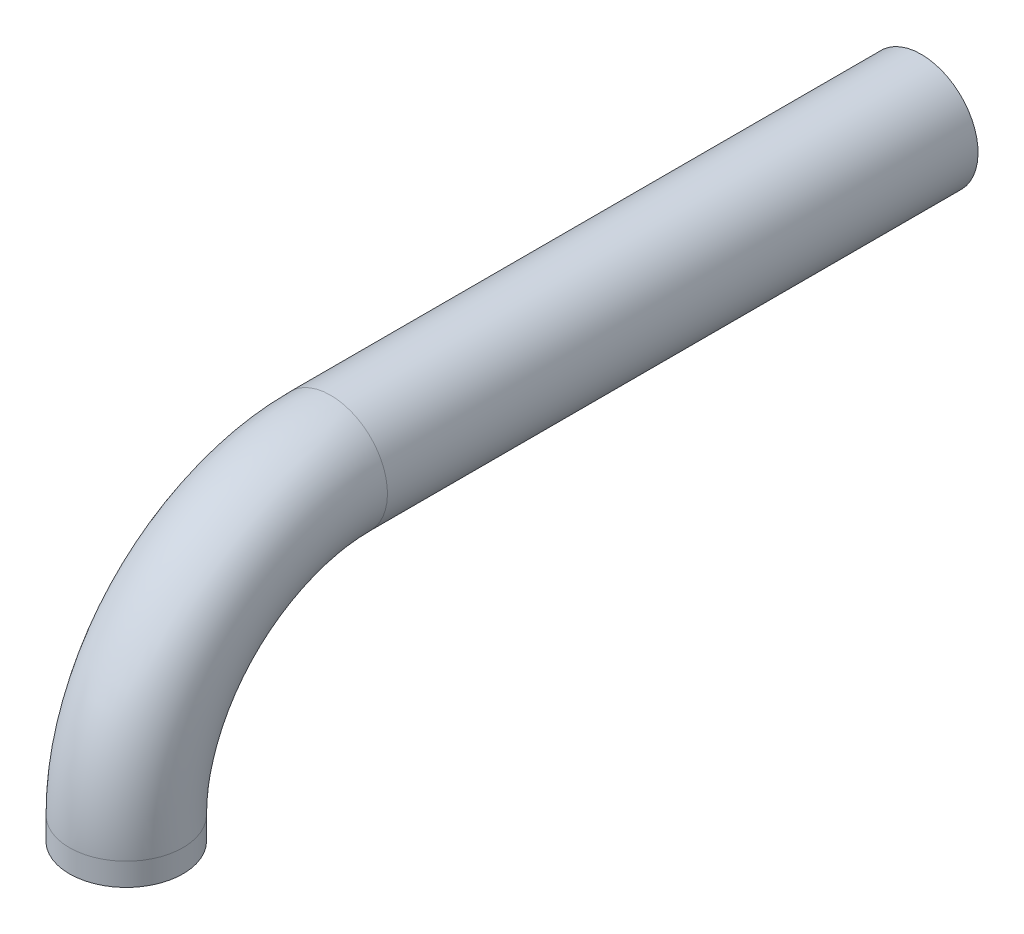
ISO-10303-21;
HEADER;
FILE_DESCRIPTION(('STEP AP214'),'2;1');
FILE_NAME('part.step','',(''),(''),'','','');
FILE_SCHEMA(('AUTOMOTIVE_DESIGN { 1 0 10303 214 1 1 1 1 }'));
ENDSEC;
DATA;
#1=APPLICATION_CONTEXT('core data for automotive mechanical design processes');
#2=APPLICATION_PROTOCOL_DEFINITION('international standard','automotive_design',2000,#1);
#3=PRODUCT_CONTEXT('',#1,'mechanical');
#4=PRODUCT('Part','Part','',(#3));
#5=PRODUCT_RELATED_PRODUCT_CATEGORY('part','',(#4));
#6=PRODUCT_DEFINITION_FORMATION('','',#4);
#7=PRODUCT_DEFINITION_CONTEXT('part definition',#1,'design');
#8=PRODUCT_DEFINITION('design','',#6,#7);
#9=PRODUCT_DEFINITION_SHAPE('','',#8);
#10=(LENGTH_UNIT() NAMED_UNIT(*) SI_UNIT(.MILLI.,.METRE.));
#11=(NAMED_UNIT(*) PLANE_ANGLE_UNIT() SI_UNIT($,.RADIAN.));
#12=(NAMED_UNIT(*) SI_UNIT($,.STERADIAN.) SOLID_ANGLE_UNIT());
#13=UNCERTAINTY_MEASURE_WITH_UNIT(LENGTH_MEASURE(1.E-05),#10,'distance_accuracy_value','');
#14=(GEOMETRIC_REPRESENTATION_CONTEXT(3) GLOBAL_UNCERTAINTY_ASSIGNED_CONTEXT((#13)) GLOBAL_UNIT_ASSIGNED_CONTEXT((#10,
#11,#12)) REPRESENTATION_CONTEXT('',''));
#15=CARTESIAN_POINT('',(0.,0.,0.));
#16=DIRECTION('',(0.,0.,1.));
#17=DIRECTION('',(1.,0.,0.));
#18=AXIS2_PLACEMENT_3D('',#15,#16,#17);
#19=CARTESIAN_POINT('',(0.,5.,-4.50000000000003));
#20=DIRECTION('',(0.,0.,-1.));
#21=DIRECTION('',(-1.,0.,0.));
#22=AXIS2_PLACEMENT_3D('',#19,#20,#21);
#23=CYLINDRICAL_SURFACE('',#22,1.25);
#24=CARTESIAN_POINT('',(0.,5.,-4.50000000000003));
#25=DIRECTION('',(0.,0.,-1.));
#26=DIRECTION('',(0.,1.,0.));
#27=AXIS2_PLACEMENT_3D('',#24,#25,#26);
#28=CIRCLE('',#27,1.25);
#29=CARTESIAN_POINT('',(0.,6.25,-4.50000000000004));
#30=VERTEX_POINT('',#29);
#31=EDGE_CURVE('E41',#30,#30,#28,.T.);
#32=ORIENTED_EDGE('',*,*,#31,.T.);
#33=EDGE_LOOP('',(#32));
#34=FACE_BOUND('',#33,.T.);
#35=CARTESIAN_POINT('',(0.,5.,-17.5));
#36=DIRECTION('',(0.,0.,-1.));
#37=DIRECTION('',(0.,1.,0.));
#38=AXIS2_PLACEMENT_3D('',#35,#36,#37);
#39=CIRCLE('',#38,1.25);
#40=CARTESIAN_POINT('',(0.,6.25,-17.5));
#41=VERTEX_POINT('',#40);
#42=EDGE_CURVE('E10',#41,#41,#39,.T.);
#43=ORIENTED_EDGE('',*,*,#42,.F.);
#44=EDGE_LOOP('',(#43));
#45=FACE_BOUND('',#44,.T.);
#46=ADVANCED_FACE('F31',(#34,#45),#23,.T.);
#47=CARTESIAN_POINT('',(0.,5.,-4.50000000000003));
#48=DIRECTION('',(0.,0.,-1.));
#49=DIRECTION('',(-1.,0.,0.));
#50=AXIS2_PLACEMENT_3D('',#47,#48,#49);
#51=CYLINDRICAL_SURFACE('',#50,1.);
#52=CARTESIAN_POINT('',(0.,5.,-4.50000000000003));
#53=DIRECTION('',(0.,0.,-1.));
#54=DIRECTION('',(0.,1.,0.));
#55=AXIS2_PLACEMENT_3D('',#52,#53,#54);
#56=CIRCLE('',#55,1.);
#57=CARTESIAN_POINT('',(0.,6.,-4.50000000000004));
#58=VERTEX_POINT('',#57);
#59=EDGE_CURVE('E45',#58,#58,#56,.T.);
#60=ORIENTED_EDGE('',*,*,#59,.F.);
#61=EDGE_LOOP('',(#60));
#62=FACE_BOUND('',#61,.T.);
#63=CARTESIAN_POINT('',(0.,5.,-17.5));
#64=DIRECTION('',(0.,0.,-1.));
#65=DIRECTION('',(0.,1.,0.));
#66=AXIS2_PLACEMENT_3D('',#63,#64,#65);
#67=CIRCLE('',#66,1.);
#68=CARTESIAN_POINT('',(0.,6.,-17.5));
#69=VERTEX_POINT('',#68);
#70=EDGE_CURVE('E37',#69,#69,#67,.T.);
#71=ORIENTED_EDGE('',*,*,#70,.T.);
#72=EDGE_LOOP('',(#71));
#73=FACE_BOUND('',#72,.T.);
#74=ADVANCED_FACE('F73',(#62,#73),#51,.F.);
#75=CARTESIAN_POINT('',(0.,0.5,-4.5));
#76=DIRECTION('',(-1.,0.,0.));
#77=DIRECTION('',(0.,0.,1.));
#78=AXIS2_PLACEMENT_3D('',#75,#76,#77);
#79=TOROIDAL_SURFACE('',#78,4.5,1.25);
#80=CARTESIAN_POINT('',(0.,0.499999999999968,0.));
#81=DIRECTION('',(0.,1.,0.));
#82=DIRECTION('',(0.,0.,1.));
#83=AXIS2_PLACEMENT_3D('',#80,#81,#82);
#84=CIRCLE('',#83,1.25);
#85=CARTESIAN_POINT('',(0.,0.499999999999959,1.25));
#86=VERTEX_POINT('',#85);
#87=EDGE_CURVE('E50',#86,#86,#84,.T.);
#88=CARTESIAN_POINT('',(0.,0.5,-4.5));
#89=DIRECTION('',(-1.,0.,0.));
#90=DIRECTION('',(0.,0.,1.));
#91=AXIS2_PLACEMENT_3D('',#88,#89,#90);
#92=CIRCLE('',#91,5.75);
#93=EDGE_CURVE('',#86,#30,#92,.T.);
#94=ORIENTED_EDGE('',*,*,#87,.T.);
#95=ORIENTED_EDGE('',*,*,#31,.F.);
#96=ORIENTED_EDGE('',*,*,#93,.T.);
#97=ORIENTED_EDGE('',*,*,#93,.F.);
#98=EDGE_LOOP('',(#94,#96,#95,#97));
#99=FACE_BOUND('',#98,.T.);
#100=ADVANCED_FACE('F69',(#99),#79,.T.);
#101=CARTESIAN_POINT('',(0.,0.5,-4.5));
#102=DIRECTION('',(-1.,0.,0.));
#103=DIRECTION('',(0.,0.,1.));
#104=AXIS2_PLACEMENT_3D('',#101,#102,#103);
#105=TOROIDAL_SURFACE('',#104,4.5,1.);
#106=CARTESIAN_POINT('',(0.,0.499999999999968,0.));
#107=DIRECTION('',(0.,1.,0.));
#108=DIRECTION('',(0.,0.,1.));
#109=AXIS2_PLACEMENT_3D('',#106,#107,#108);
#110=CIRCLE('',#109,1.);
#111=CARTESIAN_POINT('',(0.,0.499999999999961,1.));
#112=VERTEX_POINT('',#111);
#113=EDGE_CURVE('E54',#112,#112,#110,.T.);
#114=CARTESIAN_POINT('',(0.,0.5,-4.5));
#115=DIRECTION('',(-1.,0.,0.));
#116=DIRECTION('',(0.,0.,1.));
#117=AXIS2_PLACEMENT_3D('',#114,#115,#116);
#118=CIRCLE('',#117,5.5);
#119=EDGE_CURVE('',#112,#58,#118,.T.);
#120=ORIENTED_EDGE('',*,*,#113,.F.);
#121=ORIENTED_EDGE('',*,*,#59,.T.);
#122=ORIENTED_EDGE('',*,*,#119,.T.);
#123=ORIENTED_EDGE('',*,*,#119,.F.);
#124=EDGE_LOOP('',(#120,#122,#121,#123));
#125=FACE_BOUND('',#124,.T.);
#126=ADVANCED_FACE('F66',(#125),#105,.F.);
#127=CARTESIAN_POINT('',(0.,0.499999999999968,0.));
#128=DIRECTION('',(0.,-1.,0.));
#129=DIRECTION('',(0.,0.,-1.));
#130=AXIS2_PLACEMENT_3D('',#127,#128,#129);
#131=CYLINDRICAL_SURFACE('',#130,1.);
#132=ORIENTED_EDGE('',*,*,#113,.T.);
#133=EDGE_LOOP('',(#132));
#134=FACE_BOUND('',#133,.T.);
#135=CARTESIAN_POINT('',(0.,0.,0.));
#136=DIRECTION('',(0.,1.,0.));
#137=DIRECTION('',(0.,0.,1.));
#138=AXIS2_PLACEMENT_3D('',#135,#136,#137);
#139=CIRCLE('',#138,1.);
#140=CARTESIAN_POINT('',(0.,0.,1.));
#141=VERTEX_POINT('',#140);
#142=EDGE_CURVE('E55',#141,#141,#139,.T.);
#143=ORIENTED_EDGE('',*,*,#142,.F.);
#144=EDGE_LOOP('',(#143));
#145=FACE_BOUND('',#144,.T.);
#146=ADVANCED_FACE('F63',(#134,#145),#131,.F.);
#147=CARTESIAN_POINT('',(0.,0.499999999999968,0.));
#148=DIRECTION('',(0.,-1.,0.));
#149=DIRECTION('',(0.,0.,-1.));
#150=AXIS2_PLACEMENT_3D('',#147,#148,#149);
#151=CYLINDRICAL_SURFACE('',#150,1.25);
#152=ORIENTED_EDGE('',*,*,#87,.F.);
#153=EDGE_LOOP('',(#152));
#154=FACE_BOUND('',#153,.T.);
#155=CARTESIAN_POINT('',(0.,0.,0.));
#156=DIRECTION('',(0.,1.,0.));
#157=DIRECTION('',(0.,0.,1.));
#158=AXIS2_PLACEMENT_3D('',#155,#156,#157);
#159=CIRCLE('',#158,1.25);
#160=CARTESIAN_POINT('',(0.,0.,1.25));
#161=VERTEX_POINT('',#160);
#162=EDGE_CURVE('E51',#161,#161,#159,.T.);
#163=ORIENTED_EDGE('',*,*,#162,.T.);
#164=EDGE_LOOP('',(#163));
#165=FACE_BOUND('',#164,.T.);
#166=ADVANCED_FACE('F85',(#154,#165),#151,.T.);
#167=CARTESIAN_POINT('',(0.,5.,-17.5));
#168=DIRECTION('',(0.,0.,-1.));
#169=DIRECTION('',(0.,1.,0.));
#170=AXIS2_PLACEMENT_3D('',#167,#168,#169);
#171=PLANE('',#170);
#172=ORIENTED_EDGE('',*,*,#70,.F.);
#173=EDGE_LOOP('',(#172));
#174=FACE_BOUND('',#173,.T.);
#175=ORIENTED_EDGE('',*,*,#42,.T.);
#176=EDGE_LOOP('',(#175));
#177=FACE_BOUND('',#176,.T.);
#178=ADVANCED_FACE('F88',(#174,#177),#171,.T.);
#179=CARTESIAN_POINT('',(0.,0.,0.));
#180=DIRECTION('',(0.,1.,0.));
#181=DIRECTION('',(0.,0.,1.));
#182=AXIS2_PLACEMENT_3D('',#179,#180,#181);
#183=PLANE('',#182);
#184=ORIENTED_EDGE('',*,*,#142,.T.);
#185=EDGE_LOOP('',(#184));
#186=FACE_BOUND('',#185,.T.);
#187=ORIENTED_EDGE('',*,*,#162,.F.);
#188=EDGE_LOOP('',(#187));
#189=FACE_BOUND('',#188,.T.);
#190=ADVANCED_FACE('F90',(#186,#189),#183,.F.);
#191=CLOSED_SHELL('',(#46,#74,#100,#126,#146,#166,#178,#190));
#192=MANIFOLD_SOLID_BREP('B2',#191);
#193=ADVANCED_BREP_SHAPE_REPRESENTATION('',(#18,#192),#14);
#194=SHAPE_DEFINITION_REPRESENTATION(#9,#193);
ENDSEC;
END-ISO-10303-21;
